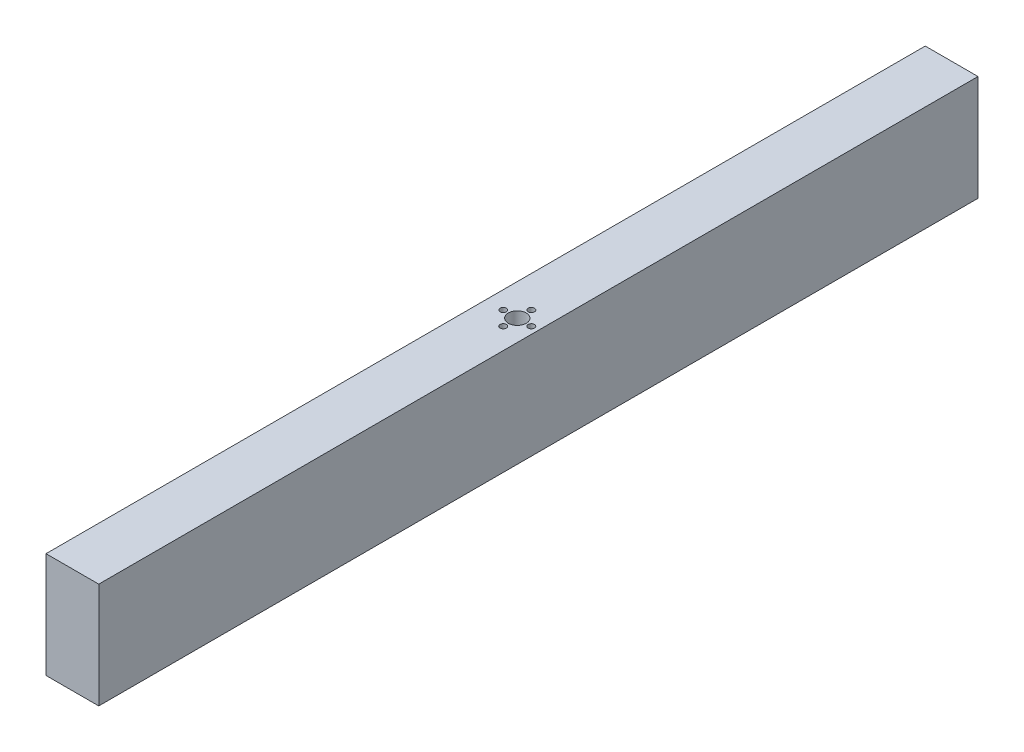
ISO-10303-21;
HEADER;
FILE_DESCRIPTION(('STEP AP214'),'2;1');
FILE_NAME('part.step','',(''),(''),'','','');
FILE_SCHEMA(('AUTOMOTIVE_DESIGN { 1 0 10303 214 1 1 1 1 }'));
ENDSEC;
DATA;
#1=APPLICATION_CONTEXT('core data for automotive mechanical design processes');
#2=APPLICATION_PROTOCOL_DEFINITION('international standard','automotive_design',2000,#1);
#3=PRODUCT_CONTEXT('',#1,'mechanical');
#4=PRODUCT('Part','Part','',(#3));
#5=PRODUCT_RELATED_PRODUCT_CATEGORY('part','',(#4));
#6=PRODUCT_DEFINITION_FORMATION('','',#4);
#7=PRODUCT_DEFINITION_CONTEXT('part definition',#1,'design');
#8=PRODUCT_DEFINITION('design','',#6,#7);
#9=PRODUCT_DEFINITION_SHAPE('','',#8);
#10=(LENGTH_UNIT() NAMED_UNIT(*) SI_UNIT(.MILLI.,.METRE.));
#11=(NAMED_UNIT(*) PLANE_ANGLE_UNIT() SI_UNIT($,.RADIAN.));
#12=(NAMED_UNIT(*) SI_UNIT($,.STERADIAN.) SOLID_ANGLE_UNIT());
#13=UNCERTAINTY_MEASURE_WITH_UNIT(LENGTH_MEASURE(1.E-05),#10,'distance_accuracy_value','');
#14=(GEOMETRIC_REPRESENTATION_CONTEXT(3) GLOBAL_UNCERTAINTY_ASSIGNED_CONTEXT((#13)) GLOBAL_UNIT_ASSIGNED_CONTEXT((#10,
#11,#12)) REPRESENTATION_CONTEXT('',''));
#15=CARTESIAN_POINT('',(0.,0.,0.));
#16=DIRECTION('',(0.,0.,1.));
#17=DIRECTION('',(1.,0.,0.));
#18=AXIS2_PLACEMENT_3D('',#15,#16,#17);
#19=CARTESIAN_POINT('',(2.99999999999998,30.,0.));
#20=DIRECTION('',(0.,-1.,0.));
#21=DIRECTION('',(0.,0.,-1.));
#22=AXIS2_PLACEMENT_3D('',#19,#20,#21);
#23=CYLINDRICAL_SURFACE('',#22,4.5);
#24=CARTESIAN_POINT('',(2.99999999999998,-20.,0.));
#25=DIRECTION('',(0.,-1.,0.));
#26=DIRECTION('',(0.,0.,-1.));
#27=AXIS2_PLACEMENT_3D('',#24,#25,#26);
#28=CIRCLE('',#27,4.5);
#29=CARTESIAN_POINT('',(2.99999999999998,-20.,-4.5));
#30=VERTEX_POINT('',#29);
#31=EDGE_CURVE('E124',#30,#30,#28,.F.);
#32=CARTESIAN_POINT('',(2.99999999999998,20.,0.));
#33=DIRECTION('',(0.,1.,0.));
#34=DIRECTION('',(0.,0.,1.));
#35=AXIS2_PLACEMENT_3D('',#32,#33,#34);
#36=CIRCLE('',#35,4.5);
#37=CARTESIAN_POINT('',(2.99999999999998,20.,-4.5));
#38=VERTEX_POINT('',#37);
#39=EDGE_CURVE('E42',#38,#38,#36,.F.);
#40=CARTESIAN_POINT('',(2.99999999999998,-20.,-4.5));
#41=CARTESIAN_POINT('',(2.99999999999998,-19.5833333333333,-4.5));
#42=CARTESIAN_POINT('',(2.99999999999998,-19.1666666666667,-4.5));
#43=CARTESIAN_POINT('',(2.99999999999998,-18.3333333333333,-4.5));
#44=CARTESIAN_POINT('',(2.99999999999998,-17.9166666666667,-4.5));
#45=CARTESIAN_POINT('',(2.99999999999998,-17.0833333333333,-4.5));
#46=CARTESIAN_POINT('',(2.99999999999998,-16.6666666666667,-4.5));
#47=CARTESIAN_POINT('',(2.99999999999998,-15.8333333333333,-4.5));
#48=CARTESIAN_POINT('',(2.99999999999998,-15.4166666666667,-4.5));
#49=CARTESIAN_POINT('',(2.99999999999998,-14.5833333333333,-4.5));
#50=CARTESIAN_POINT('',(2.99999999999998,-14.1666666666667,-4.5));
#51=CARTESIAN_POINT('',(2.99999999999998,-13.3333333333333,-4.5));
#52=CARTESIAN_POINT('',(2.99999999999998,-12.9166666666667,-4.5));
#53=CARTESIAN_POINT('',(2.99999999999998,-12.0833333333333,-4.5));
#54=CARTESIAN_POINT('',(2.99999999999998,-11.6666666666667,-4.5));
#55=CARTESIAN_POINT('',(2.99999999999998,-10.8333333333333,-4.5));
#56=CARTESIAN_POINT('',(2.99999999999998,-10.4166666666667,-4.5));
#57=CARTESIAN_POINT('',(2.99999999999998,-9.58333333333333,-4.5));
#58=CARTESIAN_POINT('',(2.99999999999998,-9.16666666666666,-4.5));
#59=CARTESIAN_POINT('',(2.99999999999998,-8.33333333333333,-4.5));
#60=CARTESIAN_POINT('',(2.99999999999998,-7.91666666666666,-4.5));
#61=CARTESIAN_POINT('',(2.99999999999998,-7.08333333333333,-4.5));
#62=CARTESIAN_POINT('',(2.99999999999998,-6.66666666666666,-4.5));
#63=CARTESIAN_POINT('',(2.99999999999998,-5.83333333333333,-4.5));
#64=CARTESIAN_POINT('',(2.99999999999998,-5.41666666666666,-4.5));
#65=CARTESIAN_POINT('',(2.99999999999998,-4.58333333333333,-4.5));
#66=CARTESIAN_POINT('',(2.99999999999998,-4.16666666666666,-4.5));
#67=CARTESIAN_POINT('',(2.99999999999998,-3.33333333333333,-4.5));
#68=CARTESIAN_POINT('',(2.99999999999998,-2.91666666666666,-4.5));
#69=CARTESIAN_POINT('',(2.99999999999998,-2.08333333333333,-4.5));
#70=CARTESIAN_POINT('',(2.99999999999998,-1.66666666666666,-4.5));
#71=CARTESIAN_POINT('',(2.99999999999998,-0.833333333333331,-4.5));
#72=CARTESIAN_POINT('',(2.99999999999998,-0.416666666666664,-4.5));
#73=CARTESIAN_POINT('',(2.99999999999998,0.41666666666667,-4.5));
#74=CARTESIAN_POINT('',(2.99999999999998,0.833333333333337,-4.5));
#75=CARTESIAN_POINT('',(2.99999999999998,1.66666666666667,-4.5));
#76=CARTESIAN_POINT('',(2.99999999999998,2.08333333333334,-4.5));
#77=CARTESIAN_POINT('',(2.99999999999998,2.91666666666667,-4.5));
#78=CARTESIAN_POINT('',(2.99999999999998,3.33333333333334,-4.5));
#79=CARTESIAN_POINT('',(2.99999999999998,4.16666666666667,-4.5));
#80=CARTESIAN_POINT('',(2.99999999999998,4.58333333333334,-4.5));
#81=CARTESIAN_POINT('',(2.99999999999998,5.41666666666667,-4.5));
#82=CARTESIAN_POINT('',(2.99999999999998,5.83333333333334,-4.5));
#83=CARTESIAN_POINT('',(2.99999999999998,6.66666666666667,-4.5));
#84=CARTESIAN_POINT('',(2.99999999999998,7.08333333333334,-4.5));
#85=CARTESIAN_POINT('',(2.99999999999998,7.91666666666667,-4.5));
#86=CARTESIAN_POINT('',(2.99999999999998,8.33333333333334,-4.5));
#87=CARTESIAN_POINT('',(2.99999999999998,9.16666666666667,-4.5));
#88=CARTESIAN_POINT('',(2.99999999999998,9.58333333333334,-4.5));
#89=CARTESIAN_POINT('',(2.99999999999998,10.4166666666667,-4.5));
#90=CARTESIAN_POINT('',(2.99999999999998,10.8333333333333,-4.5));
#91=CARTESIAN_POINT('',(2.99999999999998,11.6666666666667,-4.5));
#92=CARTESIAN_POINT('',(2.99999999999998,12.0833333333333,-4.5));
#93=CARTESIAN_POINT('',(2.99999999999998,12.9166666666667,-4.5));
#94=CARTESIAN_POINT('',(2.99999999999998,13.3333333333333,-4.5));
#95=CARTESIAN_POINT('',(2.99999999999998,14.1666666666667,-4.5));
#96=CARTESIAN_POINT('',(2.99999999999998,14.5833333333333,-4.5));
#97=CARTESIAN_POINT('',(2.99999999999998,15.4166666666667,-4.5));
#98=CARTESIAN_POINT('',(2.99999999999998,15.8333333333333,-4.5));
#99=CARTESIAN_POINT('',(2.99999999999998,16.6666666666667,-4.5));
#100=CARTESIAN_POINT('',(2.99999999999998,17.0833333333333,-4.5));
#101=CARTESIAN_POINT('',(2.99999999999998,17.9166666666667,-4.5));
#102=CARTESIAN_POINT('',(2.99999999999998,18.3333333333333,-4.5));
#103=CARTESIAN_POINT('',(2.99999999999998,19.1666666666667,-4.5));
#104=CARTESIAN_POINT('',(2.99999999999998,19.5833333333333,-4.5));
#105=CARTESIAN_POINT('',(2.99999999999998,20.,-4.5));
#106=B_SPLINE_CURVE_WITH_KNOTS('',3,(#40,#41,#42,#43,#44,#45,#46,#47,#48,#49,#50,#51,#52,#53,
#54,#55,#56,#57,#58,#59,#60,#61,#62,#63,#64,#65,#66,#67,#68,#69,#70,#71,#72,#73,#74,#75,#76,#77,
#78,#79,#80,#81,#82,#83,#84,#85,#86,#87,#88,#89,#90,#91,#92,#93,#94,#95,#96,#97,#98,#99,#100,
#101,#102,#103,#104,#105),.UNSPECIFIED.,.F.,.F.,(4,2,2,2,2,2,2,2,2,2,2,2,2,2,2,2,2,2,2,2,2,2,2,
2,2,2,2,2,2,2,2,2,4),(0.,1.25,2.5,3.75,5.,6.25,7.5,8.75,10.,11.25,12.5,13.75,15.,16.25,17.5,
18.75,20.,21.25,22.5,23.75,25.,26.25,27.5,28.75,30.,31.25,32.5,33.75,35.,36.25,37.5,38.75,40.),.UNSPECIFIED.);
#107=EDGE_CURVE('BSEAM38',#30,#38,#106,.T.);
#108=ORIENTED_EDGE('',*,*,#31,.F.);
#109=ORIENTED_EDGE('',*,*,#39,.F.);
#110=ORIENTED_EDGE('',*,*,#107,.T.);
#111=ORIENTED_EDGE('',*,*,#107,.F.);
#112=EDGE_LOOP('',(#108,#110,#109,#111));
#113=FACE_BOUND('',#112,.T.);
#114=ADVANCED_FACE('F38',(#113),#23,.F.);
#115=CARTESIAN_POINT('',(15.,-30.,250.));
#116=DIRECTION('',(-1.,0.,0.));
#117=DIRECTION('',(0.,0.,1.));
#118=AXIS2_PLACEMENT_3D('',#115,#116,#117);
#119=PLANE('',#118);
#120=DIRECTION('',(0.,1.,0.));
#121=VECTOR('',#120,1.);
#122=CARTESIAN_POINT('',(15.,-30.,-250.));
#123=LINE('',#122,#121);
#124=CARTESIAN_POINT('',(15.,-30.,-250.));
#125=VERTEX_POINT('',#124);
#126=CARTESIAN_POINT('',(15.,30.,-250.));
#127=VERTEX_POINT('',#126);
#128=EDGE_CURVE('E110',#125,#127,#123,.T.);
#129=ORIENTED_EDGE('',*,*,#128,.T.);
#130=DIRECTION('',(0.,0.,-1.));
#131=VECTOR('',#130,1.);
#132=CARTESIAN_POINT('',(15.,30.,250.));
#133=LINE('',#132,#131);
#134=CARTESIAN_POINT('',(15.,30.,250.));
#135=VERTEX_POINT('',#134);
#136=EDGE_CURVE('E11',#135,#127,#133,.T.);
#137=ORIENTED_EDGE('',*,*,#136,.F.);
#138=DIRECTION('',(0.,1.,0.));
#139=VECTOR('',#138,1.);
#140=CARTESIAN_POINT('',(15.,-30.,250.));
#141=LINE('',#140,#139);
#142=CARTESIAN_POINT('',(15.,-30.,250.));
#143=VERTEX_POINT('',#142);
#144=EDGE_CURVE('E93',#143,#135,#141,.T.);
#145=ORIENTED_EDGE('',*,*,#144,.F.);
#146=DIRECTION('',(0.,0.,-1.));
#147=VECTOR('',#146,1.);
#148=CARTESIAN_POINT('',(15.,-30.,250.));
#149=LINE('',#148,#147);
#150=EDGE_CURVE('E106',#143,#125,#149,.T.);
#151=ORIENTED_EDGE('',*,*,#150,.T.);
#152=EDGE_LOOP('',(#129,#137,#145,#151));
#153=FACE_BOUND('',#152,.T.);
#154=ADVANCED_FACE('F40',(#153),#119,.F.);
#155=CARTESIAN_POINT('',(-15.,30.,250.));
#156=DIRECTION('',(0.,-1.,0.));
#157=DIRECTION('',(0.,0.,-1.));
#158=AXIS2_PLACEMENT_3D('',#155,#156,#157);
#159=PLANE('',#158);
#160=CARTESIAN_POINT('',(2.99999999999998,30.,0.));
#161=DIRECTION('',(0.,-1.,0.));
#162=DIRECTION('',(0.,0.,-1.));
#163=AXIS2_PLACEMENT_3D('',#160,#161,#162);
#164=CIRCLE('',#163,5.1);
#165=CARTESIAN_POINT('',(2.99999999999998,30.,-5.1));
#166=VERTEX_POINT('',#165);
#167=EDGE_CURVE('E145',#166,#166,#164,.T.);
#168=ORIENTED_EDGE('',*,*,#167,.T.);
#169=EDGE_LOOP('',(#168));
#170=FACE_BOUND('',#169,.T.);
#171=CARTESIAN_POINT('',(11.,30.,0.));
#172=DIRECTION('',(0.,-1.,0.));
#173=DIRECTION('',(0.,0.,-1.));
#174=AXIS2_PLACEMENT_3D('',#171,#172,#173);
#175=CIRCLE('',#174,1.8);
#176=CARTESIAN_POINT('',(11.,30.,-1.8));
#177=VERTEX_POINT('',#176);
#178=EDGE_CURVE('E114',#177,#177,#175,.T.);
#179=ORIENTED_EDGE('',*,*,#178,.T.);
#180=EDGE_LOOP('',(#179));
#181=FACE_BOUND('',#180,.T.);
#182=CARTESIAN_POINT('',(2.99999999999998,30.,-8.));
#183=DIRECTION('',(0.,-1.,0.));
#184=DIRECTION('',(0.,0.,-1.));
#185=AXIS2_PLACEMENT_3D('',#182,#183,#184);
#186=CIRCLE('',#185,1.8);
#187=CARTESIAN_POINT('',(2.99999999999998,30.,-9.8));
#188=VERTEX_POINT('',#187);
#189=EDGE_CURVE('E167',#188,#188,#186,.T.);
#190=ORIENTED_EDGE('',*,*,#189,.T.);
#191=EDGE_LOOP('',(#190));
#192=FACE_BOUND('',#191,.T.);
#193=CARTESIAN_POINT('',(-5.00000000000002,30.,0.));
#194=DIRECTION('',(0.,-1.,0.));
#195=DIRECTION('',(0.,0.,-1.));
#196=AXIS2_PLACEMENT_3D('',#193,#194,#195);
#197=CIRCLE('',#196,1.8);
#198=CARTESIAN_POINT('',(-5.00000000000002,30.,-1.8));
#199=VERTEX_POINT('',#198);
#200=EDGE_CURVE('E148',#199,#199,#197,.T.);
#201=ORIENTED_EDGE('',*,*,#200,.T.);
#202=EDGE_LOOP('',(#201));
#203=FACE_BOUND('',#202,.T.);
#204=CARTESIAN_POINT('',(2.99999999999998,30.,8.));
#205=DIRECTION('',(0.,-1.,0.));
#206=DIRECTION('',(0.,0.,-1.));
#207=AXIS2_PLACEMENT_3D('',#204,#205,#206);
#208=CIRCLE('',#207,1.8);
#209=CARTESIAN_POINT('',(2.99999999999998,30.,6.2));
#210=VERTEX_POINT('',#209);
#211=EDGE_CURVE('E134',#210,#210,#208,.T.);
#212=ORIENTED_EDGE('',*,*,#211,.T.);
#213=EDGE_LOOP('',(#212));
#214=FACE_BOUND('',#213,.T.);
#215=DIRECTION('',(-1.,0.,0.));
#216=VECTOR('',#215,1.);
#217=CARTESIAN_POINT('',(-15.,30.,-250.));
#218=LINE('',#217,#216);
#219=CARTESIAN_POINT('',(-15.,30.,-250.));
#220=VERTEX_POINT('',#219);
#221=EDGE_CURVE('E98',#127,#220,#218,.T.);
#222=ORIENTED_EDGE('',*,*,#221,.T.);
#223=DIRECTION('',(0.,0.,-1.));
#224=VECTOR('',#223,1.);
#225=CARTESIAN_POINT('',(-15.,30.,250.));
#226=LINE('',#225,#224);
#227=CARTESIAN_POINT('',(-15.,30.,250.));
#228=VERTEX_POINT('',#227);
#229=EDGE_CURVE('E49',#228,#220,#226,.T.);
#230=ORIENTED_EDGE('',*,*,#229,.F.);
#231=DIRECTION('',(-1.,0.,0.));
#232=VECTOR('',#231,1.);
#233=CARTESIAN_POINT('',(-15.,30.,250.));
#234=LINE('',#233,#232);
#235=EDGE_CURVE('E88',#135,#228,#234,.T.);
#236=ORIENTED_EDGE('',*,*,#235,.F.);
#237=ORIENTED_EDGE('',*,*,#136,.T.);
#238=EDGE_LOOP('',(#222,#230,#236,#237));
#239=FACE_BOUND('',#238,.T.);
#240=ADVANCED_FACE('F97',(#170,#181,#192,#203,#214,#239),#159,.F.);
#241=CARTESIAN_POINT('',(-15.,-30.,250.));
#242=DIRECTION('',(1.,0.,0.));
#243=DIRECTION('',(0.,0.,-1.));
#244=AXIS2_PLACEMENT_3D('',#241,#242,#243);
#245=PLANE('',#244);
#246=DIRECTION('',(0.,-1.,0.));
#247=VECTOR('',#246,1.);
#248=CARTESIAN_POINT('',(-15.,-30.,-250.));
#249=LINE('',#248,#247);
#250=CARTESIAN_POINT('',(-15.,-30.,-250.));
#251=VERTEX_POINT('',#250);
#252=EDGE_CURVE('E75',#220,#251,#249,.T.);
#253=ORIENTED_EDGE('',*,*,#252,.T.);
#254=DIRECTION('',(0.,0.,-1.));
#255=VECTOR('',#254,1.);
#256=CARTESIAN_POINT('',(-15.,-30.,250.));
#257=LINE('',#256,#255);
#258=CARTESIAN_POINT('',(-15.,-30.,250.));
#259=VERTEX_POINT('',#258);
#260=EDGE_CURVE('E100',#259,#251,#257,.T.);
#261=ORIENTED_EDGE('',*,*,#260,.F.);
#262=DIRECTION('',(0.,-1.,0.));
#263=VECTOR('',#262,1.);
#264=CARTESIAN_POINT('',(-15.,-30.,250.));
#265=LINE('',#264,#263);
#266=EDGE_CURVE('E91',#228,#259,#265,.T.);
#267=ORIENTED_EDGE('',*,*,#266,.F.);
#268=ORIENTED_EDGE('',*,*,#229,.T.);
#269=EDGE_LOOP('',(#253,#261,#267,#268));
#270=FACE_BOUND('',#269,.T.);
#271=ADVANCED_FACE('F102',(#270),#245,.F.);
#272=CARTESIAN_POINT('',(-15.,-30.,250.));
#273=DIRECTION('',(0.,1.,0.));
#274=DIRECTION('',(0.,0.,1.));
#275=AXIS2_PLACEMENT_3D('',#272,#273,#274);
#276=PLANE('',#275);
#277=CARTESIAN_POINT('',(2.99999999999998,-30.,0.));
#278=DIRECTION('',(0.,-1.,0.));
#279=DIRECTION('',(0.,0.,-1.));
#280=AXIS2_PLACEMENT_3D('',#277,#278,#279);
#281=CIRCLE('',#280,5.1);
#282=CARTESIAN_POINT('',(2.99999999999998,-30.,-5.1));
#283=VERTEX_POINT('',#282);
#284=EDGE_CURVE('E137',#283,#283,#281,.T.);
#285=ORIENTED_EDGE('',*,*,#284,.F.);
#286=EDGE_LOOP('',(#285));
#287=FACE_BOUND('',#286,.T.);
#288=CARTESIAN_POINT('',(11.,-30.,0.));
#289=DIRECTION('',(0.,-1.,0.));
#290=DIRECTION('',(0.,0.,-1.));
#291=AXIS2_PLACEMENT_3D('',#288,#289,#290);
#292=CIRCLE('',#291,1.8);
#293=CARTESIAN_POINT('',(11.,-30.,-1.8));
#294=VERTEX_POINT('',#293);
#295=EDGE_CURVE('E163',#294,#294,#292,.T.);
#296=ORIENTED_EDGE('',*,*,#295,.F.);
#297=EDGE_LOOP('',(#296));
#298=FACE_BOUND('',#297,.T.);
#299=CARTESIAN_POINT('',(2.99999999999998,-30.,-8.));
#300=DIRECTION('',(0.,-1.,0.));
#301=DIRECTION('',(0.,0.,-1.));
#302=AXIS2_PLACEMENT_3D('',#299,#300,#301);
#303=CIRCLE('',#302,1.8);
#304=CARTESIAN_POINT('',(2.99999999999998,-30.,-9.8));
#305=VERTEX_POINT('',#304);
#306=EDGE_CURVE('E152',#305,#305,#303,.T.);
#307=ORIENTED_EDGE('',*,*,#306,.F.);
#308=EDGE_LOOP('',(#307));
#309=FACE_BOUND('',#308,.T.);
#310=CARTESIAN_POINT('',(-5.00000000000002,-30.,0.));
#311=DIRECTION('',(0.,-1.,0.));
#312=DIRECTION('',(0.,0.,-1.));
#313=AXIS2_PLACEMENT_3D('',#310,#311,#312);
#314=CIRCLE('',#313,1.8);
#315=CARTESIAN_POINT('',(-5.00000000000002,-30.,-1.8));
#316=VERTEX_POINT('',#315);
#317=EDGE_CURVE('E153',#316,#316,#314,.T.);
#318=ORIENTED_EDGE('',*,*,#317,.F.);
#319=EDGE_LOOP('',(#318));
#320=FACE_BOUND('',#319,.T.);
#321=CARTESIAN_POINT('',(2.99999999999998,-30.,8.));
#322=DIRECTION('',(0.,-1.,0.));
#323=DIRECTION('',(0.,0.,-1.));
#324=AXIS2_PLACEMENT_3D('',#321,#322,#323);
#325=CIRCLE('',#324,1.8);
#326=CARTESIAN_POINT('',(2.99999999999998,-30.,6.2));
#327=VERTEX_POINT('',#326);
#328=EDGE_CURVE('E127',#327,#327,#325,.T.);
#329=ORIENTED_EDGE('',*,*,#328,.F.);
#330=EDGE_LOOP('',(#329));
#331=FACE_BOUND('',#330,.T.);
#332=DIRECTION('',(1.,0.,0.));
#333=VECTOR('',#332,1.);
#334=CARTESIAN_POINT('',(-15.,-30.,-250.));
#335=LINE('',#334,#333);
#336=EDGE_CURVE('E81',#251,#125,#335,.T.);
#337=ORIENTED_EDGE('',*,*,#336,.T.);
#338=ORIENTED_EDGE('',*,*,#150,.F.);
#339=DIRECTION('',(1.,0.,0.));
#340=VECTOR('',#339,1.);
#341=CARTESIAN_POINT('',(-15.,-30.,250.));
#342=LINE('',#341,#340);
#343=EDGE_CURVE('E58',#259,#143,#342,.T.);
#344=ORIENTED_EDGE('',*,*,#343,.F.);
#345=ORIENTED_EDGE('',*,*,#260,.T.);
#346=EDGE_LOOP('',(#337,#338,#344,#345));
#347=FACE_BOUND('',#346,.T.);
#348=ADVANCED_FACE('F178',(#287,#298,#309,#320,#331,#347),#276,.F.);
#349=CARTESIAN_POINT('',(0.,0.,250.));
#350=DIRECTION('',(0.,0.,-1.));
#351=DIRECTION('',(-1.,0.,0.));
#352=AXIS2_PLACEMENT_3D('',#349,#350,#351);
#353=PLANE('',#352);
#354=ORIENTED_EDGE('',*,*,#144,.T.);
#355=ORIENTED_EDGE('',*,*,#235,.T.);
#356=ORIENTED_EDGE('',*,*,#266,.T.);
#357=ORIENTED_EDGE('',*,*,#343,.T.);
#358=EDGE_LOOP('',(#354,#355,#356,#357));
#359=FACE_BOUND('',#358,.T.);
#360=ADVANCED_FACE('F89',(#359),#353,.F.);
#361=CARTESIAN_POINT('',(0.,0.,-250.));
#362=DIRECTION('',(0.,0.,-1.));
#363=DIRECTION('',(-1.,0.,0.));
#364=AXIS2_PLACEMENT_3D('',#361,#362,#363);
#365=PLANE('',#364);
#366=ORIENTED_EDGE('',*,*,#128,.F.);
#367=ORIENTED_EDGE('',*,*,#336,.F.);
#368=ORIENTED_EDGE('',*,*,#252,.F.);
#369=ORIENTED_EDGE('',*,*,#221,.F.);
#370=EDGE_LOOP('',(#366,#367,#368,#369));
#371=FACE_BOUND('',#370,.T.);
#372=ADVANCED_FACE('F190',(#371),#365,.T.);
#373=CARTESIAN_POINT('',(2.99999999999998,30.,8.));
#374=DIRECTION('',(0.,-1.,0.));
#375=DIRECTION('',(0.,0.,-1.));
#376=AXIS2_PLACEMENT_3D('',#373,#374,#375);
#377=CYLINDRICAL_SURFACE('',#376,1.8);
#378=CARTESIAN_POINT('',(2.99999999999998,30.,6.2));
#379=CARTESIAN_POINT('',(2.99999999999998,29.375,6.2));
#380=CARTESIAN_POINT('',(2.99999999999998,28.75,6.2));
#381=CARTESIAN_POINT('',(2.99999999999998,27.5,6.2));
#382=CARTESIAN_POINT('',(2.99999999999998,26.875,6.2));
#383=CARTESIAN_POINT('',(2.99999999999998,25.625,6.2));
#384=CARTESIAN_POINT('',(2.99999999999998,25.,6.2));
#385=CARTESIAN_POINT('',(2.99999999999998,23.75,6.2));
#386=CARTESIAN_POINT('',(2.99999999999998,23.125,6.2));
#387=CARTESIAN_POINT('',(2.99999999999998,21.875,6.2));
#388=CARTESIAN_POINT('',(2.99999999999998,21.25,6.2));
#389=CARTESIAN_POINT('',(2.99999999999998,20.,6.2));
#390=CARTESIAN_POINT('',(2.99999999999998,19.375,6.2));
#391=CARTESIAN_POINT('',(2.99999999999998,18.125,6.2));
#392=CARTESIAN_POINT('',(2.99999999999998,17.5,6.2));
#393=CARTESIAN_POINT('',(2.99999999999998,16.25,6.2));
#394=CARTESIAN_POINT('',(2.99999999999998,15.625,6.2));
#395=CARTESIAN_POINT('',(2.99999999999998,14.375,6.2));
#396=CARTESIAN_POINT('',(2.99999999999998,13.75,6.2));
#397=CARTESIAN_POINT('',(2.99999999999998,12.5,6.2));
#398=CARTESIAN_POINT('',(2.99999999999998,11.875,6.2));
#399=CARTESIAN_POINT('',(2.99999999999998,10.625,6.2));
#400=CARTESIAN_POINT('',(2.99999999999998,10.,6.2));
#401=CARTESIAN_POINT('',(2.99999999999998,8.75,6.2));
#402=CARTESIAN_POINT('',(2.99999999999998,8.125,6.2));
#403=CARTESIAN_POINT('',(2.99999999999998,6.875,6.2));
#404=CARTESIAN_POINT('',(2.99999999999998,6.25,6.2));
#405=CARTESIAN_POINT('',(2.99999999999998,4.99999999999999,6.2));
#406=CARTESIAN_POINT('',(2.99999999999998,4.375,6.2));
#407=CARTESIAN_POINT('',(2.99999999999998,3.125,6.2));
#408=CARTESIAN_POINT('',(2.99999999999998,2.5,6.2));
#409=CARTESIAN_POINT('',(2.99999999999998,1.25,6.2));
#410=CARTESIAN_POINT('',(2.99999999999998,0.624999999999997,6.2));
#411=CARTESIAN_POINT('',(2.99999999999998,-0.625000000000004,6.2));
#412=CARTESIAN_POINT('',(2.99999999999998,-1.25,6.2));
#413=CARTESIAN_POINT('',(2.99999999999998,-2.50000000000001,6.2));
#414=CARTESIAN_POINT('',(2.99999999999998,-3.12500000000001,6.2));
#415=CARTESIAN_POINT('',(2.99999999999998,-4.375,6.2));
#416=CARTESIAN_POINT('',(2.99999999999998,-5.,6.2));
#417=CARTESIAN_POINT('',(2.99999999999998,-6.25,6.2));
#418=CARTESIAN_POINT('',(2.99999999999998,-6.875,6.2));
#419=CARTESIAN_POINT('',(2.99999999999998,-8.125,6.2));
#420=CARTESIAN_POINT('',(2.99999999999998,-8.75,6.2));
#421=CARTESIAN_POINT('',(2.99999999999998,-10.,6.2));
#422=CARTESIAN_POINT('',(2.99999999999998,-10.625,6.2));
#423=CARTESIAN_POINT('',(2.99999999999998,-11.875,6.2));
#424=CARTESIAN_POINT('',(2.99999999999998,-12.5,6.2));
#425=CARTESIAN_POINT('',(2.99999999999998,-13.75,6.2));
#426=CARTESIAN_POINT('',(2.99999999999998,-14.375,6.2));
#427=CARTESIAN_POINT('',(2.99999999999998,-15.625,6.2));
#428=CARTESIAN_POINT('',(2.99999999999998,-16.25,6.2));
#429=CARTESIAN_POINT('',(2.99999999999998,-17.5,6.2));
#430=CARTESIAN_POINT('',(2.99999999999998,-18.125,6.2));
#431=CARTESIAN_POINT('',(2.99999999999998,-19.375,6.2));
#432=CARTESIAN_POINT('',(2.99999999999998,-20.,6.2));
#433=CARTESIAN_POINT('',(2.99999999999998,-21.25,6.2));
#434=CARTESIAN_POINT('',(2.99999999999998,-21.875,6.2));
#435=CARTESIAN_POINT('',(2.99999999999998,-23.125,6.2));
#436=CARTESIAN_POINT('',(2.99999999999998,-23.75,6.2));
#437=CARTESIAN_POINT('',(2.99999999999998,-25.,6.2));
#438=CARTESIAN_POINT('',(2.99999999999998,-25.625,6.2));
#439=CARTESIAN_POINT('',(2.99999999999998,-26.875,6.2));
#440=CARTESIAN_POINT('',(2.99999999999998,-27.5,6.2));
#441=CARTESIAN_POINT('',(2.99999999999998,-28.75,6.2));
#442=CARTESIAN_POINT('',(2.99999999999998,-29.375,6.2));
#443=CARTESIAN_POINT('',(2.99999999999998,-30.,6.2));
#444=B_SPLINE_CURVE_WITH_KNOTS('',3,(#378,#379,#380,#381,#382,#383,#384,#385,#386,#387,#388,
#389,#390,#391,#392,#393,#394,#395,#396,#397,#398,#399,#400,#401,#402,#403,#404,#405,#406,#407,
#408,#409,#410,#411,#412,#413,#414,#415,#416,#417,#418,#419,#420,#421,#422,#423,#424,#425,#426,
#427,#428,#429,#430,#431,#432,#433,#434,#435,#436,#437,#438,#439,#440,#441,#442,#443),
.UNSPECIFIED.,.F.,.F.,(4,2,2,2,2,2,2,2,2,2,2,2,2,2,2,2,2,2,2,2,2,2,2,2,2,2,2,2,2,2,2,2,4),(0.,
1.875,3.75,5.625,7.5,9.375,11.25,13.125,15.,16.875,18.75,20.625,22.5,24.375,26.25,28.125,30.,
31.875,33.75,35.625,37.5,39.375,41.25,43.125,45.,46.875,48.75,50.625,52.5,54.375,56.25,58.125,
60.),.UNSPECIFIED.);
#445=EDGE_CURVE('BSEAM187',#210,#327,#444,.T.);
#446=ORIENTED_EDGE('',*,*,#211,.F.);
#447=ORIENTED_EDGE('',*,*,#328,.T.);
#448=ORIENTED_EDGE('',*,*,#445,.T.);
#449=ORIENTED_EDGE('',*,*,#445,.F.);
#450=EDGE_LOOP('',(#446,#448,#447,#449));
#451=FACE_BOUND('',#450,.T.);
#452=ADVANCED_FACE('F187',(#451),#377,.F.);
#453=CARTESIAN_POINT('',(-5.00000000000002,30.,0.));
#454=DIRECTION('',(0.,-1.,0.));
#455=DIRECTION('',(0.,0.,-1.));
#456=AXIS2_PLACEMENT_3D('',#453,#454,#455);
#457=CYLINDRICAL_SURFACE('',#456,1.8);
#458=CARTESIAN_POINT('',(-5.00000000000002,30.,-1.8));
#459=CARTESIAN_POINT('',(-5.00000000000002,29.375,-1.8));
#460=CARTESIAN_POINT('',(-5.00000000000002,28.75,-1.8));
#461=CARTESIAN_POINT('',(-5.00000000000002,27.5,-1.8));
#462=CARTESIAN_POINT('',(-5.00000000000002,26.875,-1.8));
#463=CARTESIAN_POINT('',(-5.00000000000002,25.625,-1.8));
#464=CARTESIAN_POINT('',(-5.00000000000002,25.,-1.8));
#465=CARTESIAN_POINT('',(-5.00000000000002,23.75,-1.8));
#466=CARTESIAN_POINT('',(-5.00000000000002,23.125,-1.8));
#467=CARTESIAN_POINT('',(-5.00000000000002,21.875,-1.8));
#468=CARTESIAN_POINT('',(-5.00000000000002,21.25,-1.8));
#469=CARTESIAN_POINT('',(-5.00000000000002,20.,-1.8));
#470=CARTESIAN_POINT('',(-5.00000000000002,19.375,-1.8));
#471=CARTESIAN_POINT('',(-5.00000000000002,18.125,-1.8));
#472=CARTESIAN_POINT('',(-5.00000000000002,17.5,-1.8));
#473=CARTESIAN_POINT('',(-5.00000000000002,16.25,-1.8));
#474=CARTESIAN_POINT('',(-5.00000000000002,15.625,-1.8));
#475=CARTESIAN_POINT('',(-5.00000000000002,14.375,-1.8));
#476=CARTESIAN_POINT('',(-5.00000000000002,13.75,-1.8));
#477=CARTESIAN_POINT('',(-5.00000000000002,12.5,-1.8));
#478=CARTESIAN_POINT('',(-5.00000000000002,11.875,-1.8));
#479=CARTESIAN_POINT('',(-5.00000000000002,10.625,-1.8));
#480=CARTESIAN_POINT('',(-5.00000000000002,10.,-1.8));
#481=CARTESIAN_POINT('',(-5.00000000000002,8.75,-1.8));
#482=CARTESIAN_POINT('',(-5.00000000000002,8.125,-1.8));
#483=CARTESIAN_POINT('',(-5.00000000000002,6.875,-1.8));
#484=CARTESIAN_POINT('',(-5.00000000000002,6.25,-1.8));
#485=CARTESIAN_POINT('',(-5.00000000000002,4.99999999999999,-1.8));
#486=CARTESIAN_POINT('',(-5.00000000000002,4.375,-1.8));
#487=CARTESIAN_POINT('',(-5.00000000000002,3.125,-1.8));
#488=CARTESIAN_POINT('',(-5.00000000000002,2.5,-1.8));
#489=CARTESIAN_POINT('',(-5.00000000000002,1.25,-1.8));
#490=CARTESIAN_POINT('',(-5.00000000000002,0.624999999999997,-1.8));
#491=CARTESIAN_POINT('',(-5.00000000000002,-0.625000000000004,-1.8));
#492=CARTESIAN_POINT('',(-5.00000000000002,-1.25,-1.8));
#493=CARTESIAN_POINT('',(-5.00000000000002,-2.50000000000001,-1.8));
#494=CARTESIAN_POINT('',(-5.00000000000002,-3.12500000000001,-1.8));
#495=CARTESIAN_POINT('',(-5.00000000000002,-4.375,-1.8));
#496=CARTESIAN_POINT('',(-5.00000000000002,-5.,-1.8));
#497=CARTESIAN_POINT('',(-5.00000000000002,-6.25,-1.8));
#498=CARTESIAN_POINT('',(-5.00000000000002,-6.875,-1.8));
#499=CARTESIAN_POINT('',(-5.00000000000002,-8.125,-1.8));
#500=CARTESIAN_POINT('',(-5.00000000000002,-8.75,-1.8));
#501=CARTESIAN_POINT('',(-5.00000000000002,-10.,-1.8));
#502=CARTESIAN_POINT('',(-5.00000000000002,-10.625,-1.8));
#503=CARTESIAN_POINT('',(-5.00000000000002,-11.875,-1.8));
#504=CARTESIAN_POINT('',(-5.00000000000002,-12.5,-1.8));
#505=CARTESIAN_POINT('',(-5.00000000000002,-13.75,-1.8));
#506=CARTESIAN_POINT('',(-5.00000000000002,-14.375,-1.8));
#507=CARTESIAN_POINT('',(-5.00000000000002,-15.625,-1.8));
#508=CARTESIAN_POINT('',(-5.00000000000002,-16.25,-1.8));
#509=CARTESIAN_POINT('',(-5.00000000000002,-17.5,-1.8));
#510=CARTESIAN_POINT('',(-5.00000000000002,-18.125,-1.8));
#511=CARTESIAN_POINT('',(-5.00000000000002,-19.375,-1.8));
#512=CARTESIAN_POINT('',(-5.00000000000002,-20.,-1.8));
#513=CARTESIAN_POINT('',(-5.00000000000002,-21.25,-1.8));
#514=CARTESIAN_POINT('',(-5.00000000000002,-21.875,-1.8));
#515=CARTESIAN_POINT('',(-5.00000000000002,-23.125,-1.8));
#516=CARTESIAN_POINT('',(-5.00000000000002,-23.75,-1.8));
#517=CARTESIAN_POINT('',(-5.00000000000002,-25.,-1.8));
#518=CARTESIAN_POINT('',(-5.00000000000002,-25.625,-1.8));
#519=CARTESIAN_POINT('',(-5.00000000000002,-26.875,-1.8));
#520=CARTESIAN_POINT('',(-5.00000000000002,-27.5,-1.8));
#521=CARTESIAN_POINT('',(-5.00000000000002,-28.75,-1.8));
#522=CARTESIAN_POINT('',(-5.00000000000002,-29.375,-1.8));
#523=CARTESIAN_POINT('',(-5.00000000000002,-30.,-1.8));
#524=B_SPLINE_CURVE_WITH_KNOTS('',3,(#458,#459,#460,#461,#462,#463,#464,#465,#466,#467,#468,
#469,#470,#471,#472,#473,#474,#475,#476,#477,#478,#479,#480,#481,#482,#483,#484,#485,#486,#487,
#488,#489,#490,#491,#492,#493,#494,#495,#496,#497,#498,#499,#500,#501,#502,#503,#504,#505,#506,
#507,#508,#509,#510,#511,#512,#513,#514,#515,#516,#517,#518,#519,#520,#521,#522,#523),
.UNSPECIFIED.,.F.,.F.,(4,2,2,2,2,2,2,2,2,2,2,2,2,2,2,2,2,2,2,2,2,2,2,2,2,2,2,2,2,2,2,2,4),(0.,
1.875,3.75,5.625,7.5,9.375,11.25,13.125,15.,16.875,18.75,20.625,22.5,24.375,26.25,28.125,30.,
31.875,33.75,35.625,37.5,39.375,41.25,43.125,45.,46.875,48.75,50.625,52.5,54.375,56.25,58.125,
60.),.UNSPECIFIED.);
#525=EDGE_CURVE('BSEAM189',#199,#316,#524,.T.);
#526=ORIENTED_EDGE('',*,*,#200,.F.);
#527=ORIENTED_EDGE('',*,*,#317,.T.);
#528=ORIENTED_EDGE('',*,*,#525,.T.);
#529=ORIENTED_EDGE('',*,*,#525,.F.);
#530=EDGE_LOOP('',(#526,#528,#527,#529));
#531=FACE_BOUND('',#530,.T.);
#532=ADVANCED_FACE('F189',(#531),#457,.F.);
#533=CARTESIAN_POINT('',(2.99999999999998,30.,-8.));
#534=DIRECTION('',(0.,-1.,0.));
#535=DIRECTION('',(0.,0.,-1.));
#536=AXIS2_PLACEMENT_3D('',#533,#534,#535);
#537=CYLINDRICAL_SURFACE('',#536,1.8);
#538=CARTESIAN_POINT('',(2.99999999999998,30.,-9.8));
#539=CARTESIAN_POINT('',(2.99999999999998,29.375,-9.8));
#540=CARTESIAN_POINT('',(2.99999999999998,28.75,-9.8));
#541=CARTESIAN_POINT('',(2.99999999999998,27.5,-9.8));
#542=CARTESIAN_POINT('',(2.99999999999998,26.875,-9.8));
#543=CARTESIAN_POINT('',(2.99999999999998,25.625,-9.8));
#544=CARTESIAN_POINT('',(2.99999999999998,25.,-9.8));
#545=CARTESIAN_POINT('',(2.99999999999998,23.75,-9.8));
#546=CARTESIAN_POINT('',(2.99999999999998,23.125,-9.8));
#547=CARTESIAN_POINT('',(2.99999999999998,21.875,-9.8));
#548=CARTESIAN_POINT('',(2.99999999999998,21.25,-9.8));
#549=CARTESIAN_POINT('',(2.99999999999998,20.,-9.8));
#550=CARTESIAN_POINT('',(2.99999999999998,19.375,-9.8));
#551=CARTESIAN_POINT('',(2.99999999999998,18.125,-9.8));
#552=CARTESIAN_POINT('',(2.99999999999998,17.5,-9.8));
#553=CARTESIAN_POINT('',(2.99999999999998,16.25,-9.8));
#554=CARTESIAN_POINT('',(2.99999999999998,15.625,-9.8));
#555=CARTESIAN_POINT('',(2.99999999999998,14.375,-9.8));
#556=CARTESIAN_POINT('',(2.99999999999998,13.75,-9.8));
#557=CARTESIAN_POINT('',(2.99999999999998,12.5,-9.8));
#558=CARTESIAN_POINT('',(2.99999999999998,11.875,-9.8));
#559=CARTESIAN_POINT('',(2.99999999999998,10.625,-9.8));
#560=CARTESIAN_POINT('',(2.99999999999998,10.,-9.8));
#561=CARTESIAN_POINT('',(2.99999999999998,8.75,-9.8));
#562=CARTESIAN_POINT('',(2.99999999999998,8.125,-9.8));
#563=CARTESIAN_POINT('',(2.99999999999998,6.875,-9.8));
#564=CARTESIAN_POINT('',(2.99999999999998,6.25,-9.8));
#565=CARTESIAN_POINT('',(2.99999999999998,4.99999999999999,-9.8));
#566=CARTESIAN_POINT('',(2.99999999999998,4.375,-9.8));
#567=CARTESIAN_POINT('',(2.99999999999998,3.125,-9.8));
#568=CARTESIAN_POINT('',(2.99999999999998,2.5,-9.8));
#569=CARTESIAN_POINT('',(2.99999999999998,1.25,-9.8));
#570=CARTESIAN_POINT('',(2.99999999999998,0.624999999999997,-9.8));
#571=CARTESIAN_POINT('',(2.99999999999998,-0.625000000000004,-9.8));
#572=CARTESIAN_POINT('',(2.99999999999998,-1.25,-9.8));
#573=CARTESIAN_POINT('',(2.99999999999998,-2.50000000000001,-9.8));
#574=CARTESIAN_POINT('',(2.99999999999998,-3.12500000000001,-9.8));
#575=CARTESIAN_POINT('',(2.99999999999998,-4.375,-9.8));
#576=CARTESIAN_POINT('',(2.99999999999998,-5.,-9.8));
#577=CARTESIAN_POINT('',(2.99999999999998,-6.25,-9.8));
#578=CARTESIAN_POINT('',(2.99999999999998,-6.875,-9.8));
#579=CARTESIAN_POINT('',(2.99999999999998,-8.125,-9.8));
#580=CARTESIAN_POINT('',(2.99999999999998,-8.75,-9.8));
#581=CARTESIAN_POINT('',(2.99999999999998,-10.,-9.8));
#582=CARTESIAN_POINT('',(2.99999999999998,-10.625,-9.8));
#583=CARTESIAN_POINT('',(2.99999999999998,-11.875,-9.8));
#584=CARTESIAN_POINT('',(2.99999999999998,-12.5,-9.8));
#585=CARTESIAN_POINT('',(2.99999999999998,-13.75,-9.8));
#586=CARTESIAN_POINT('',(2.99999999999998,-14.375,-9.8));
#587=CARTESIAN_POINT('',(2.99999999999998,-15.625,-9.8));
#588=CARTESIAN_POINT('',(2.99999999999998,-16.25,-9.8));
#589=CARTESIAN_POINT('',(2.99999999999998,-17.5,-9.8));
#590=CARTESIAN_POINT('',(2.99999999999998,-18.125,-9.8));
#591=CARTESIAN_POINT('',(2.99999999999998,-19.375,-9.8));
#592=CARTESIAN_POINT('',(2.99999999999998,-20.,-9.8));
#593=CARTESIAN_POINT('',(2.99999999999998,-21.25,-9.8));
#594=CARTESIAN_POINT('',(2.99999999999998,-21.875,-9.8));
#595=CARTESIAN_POINT('',(2.99999999999998,-23.125,-9.8));
#596=CARTESIAN_POINT('',(2.99999999999998,-23.75,-9.8));
#597=CARTESIAN_POINT('',(2.99999999999998,-25.,-9.8));
#598=CARTESIAN_POINT('',(2.99999999999998,-25.625,-9.8));
#599=CARTESIAN_POINT('',(2.99999999999998,-26.875,-9.8));
#600=CARTESIAN_POINT('',(2.99999999999998,-27.5,-9.8));
#601=CARTESIAN_POINT('',(2.99999999999998,-28.75,-9.8));
#602=CARTESIAN_POINT('',(2.99999999999998,-29.375,-9.8));
#603=CARTESIAN_POINT('',(2.99999999999998,-30.,-9.8));
#604=B_SPLINE_CURVE_WITH_KNOTS('',3,(#538,#539,#540,#541,#542,#543,#544,#545,#546,#547,#548,
#549,#550,#551,#552,#553,#554,#555,#556,#557,#558,#559,#560,#561,#562,#563,#564,#565,#566,#567,
#568,#569,#570,#571,#572,#573,#574,#575,#576,#577,#578,#579,#580,#581,#582,#583,#584,#585,#586,
#587,#588,#589,#590,#591,#592,#593,#594,#595,#596,#597,#598,#599,#600,#601,#602,#603),
.UNSPECIFIED.,.F.,.F.,(4,2,2,2,2,2,2,2,2,2,2,2,2,2,2,2,2,2,2,2,2,2,2,2,2,2,2,2,2,2,2,2,4),(0.,
1.875,3.75,5.625,7.5,9.375,11.25,13.125,15.,16.875,18.75,20.625,22.5,24.375,26.25,28.125,30.,
31.875,33.75,35.625,37.5,39.375,41.25,43.125,45.,46.875,48.75,50.625,52.5,54.375,56.25,58.125,
60.),.UNSPECIFIED.);
#605=EDGE_CURVE('BSEAM176',#188,#305,#604,.T.);
#606=ORIENTED_EDGE('',*,*,#189,.F.);
#607=ORIENTED_EDGE('',*,*,#306,.T.);
#608=ORIENTED_EDGE('',*,*,#605,.T.);
#609=ORIENTED_EDGE('',*,*,#605,.F.);
#610=EDGE_LOOP('',(#606,#608,#607,#609));
#611=FACE_BOUND('',#610,.T.);
#612=ADVANCED_FACE('F176',(#611),#537,.F.);
#613=CARTESIAN_POINT('',(11.,30.,0.));
#614=DIRECTION('',(0.,-1.,0.));
#615=DIRECTION('',(0.,0.,-1.));
#616=AXIS2_PLACEMENT_3D('',#613,#614,#615);
#617=CYLINDRICAL_SURFACE('',#616,1.8);
#618=CARTESIAN_POINT('',(11.,30.,-1.8));
#619=CARTESIAN_POINT('',(11.,29.375,-1.8));
#620=CARTESIAN_POINT('',(11.,28.75,-1.8));
#621=CARTESIAN_POINT('',(11.,27.5,-1.8));
#622=CARTESIAN_POINT('',(11.,26.875,-1.8));
#623=CARTESIAN_POINT('',(11.,25.625,-1.8));
#624=CARTESIAN_POINT('',(11.,25.,-1.8));
#625=CARTESIAN_POINT('',(11.,23.75,-1.8));
#626=CARTESIAN_POINT('',(11.,23.125,-1.8));
#627=CARTESIAN_POINT('',(11.,21.875,-1.8));
#628=CARTESIAN_POINT('',(11.,21.25,-1.8));
#629=CARTESIAN_POINT('',(11.,20.,-1.8));
#630=CARTESIAN_POINT('',(11.,19.375,-1.8));
#631=CARTESIAN_POINT('',(11.,18.125,-1.8));
#632=CARTESIAN_POINT('',(11.,17.5,-1.8));
#633=CARTESIAN_POINT('',(11.,16.25,-1.8));
#634=CARTESIAN_POINT('',(11.,15.625,-1.8));
#635=CARTESIAN_POINT('',(11.,14.375,-1.8));
#636=CARTESIAN_POINT('',(11.,13.75,-1.8));
#637=CARTESIAN_POINT('',(11.,12.5,-1.8));
#638=CARTESIAN_POINT('',(11.,11.875,-1.8));
#639=CARTESIAN_POINT('',(11.,10.625,-1.8));
#640=CARTESIAN_POINT('',(11.,10.,-1.8));
#641=CARTESIAN_POINT('',(11.,8.75,-1.8));
#642=CARTESIAN_POINT('',(11.,8.125,-1.8));
#643=CARTESIAN_POINT('',(11.,6.875,-1.8));
#644=CARTESIAN_POINT('',(11.,6.25,-1.8));
#645=CARTESIAN_POINT('',(11.,4.99999999999999,-1.8));
#646=CARTESIAN_POINT('',(11.,4.375,-1.8));
#647=CARTESIAN_POINT('',(11.,3.125,-1.8));
#648=CARTESIAN_POINT('',(11.,2.5,-1.8));
#649=CARTESIAN_POINT('',(11.,1.25,-1.8));
#650=CARTESIAN_POINT('',(11.,0.624999999999997,-1.8));
#651=CARTESIAN_POINT('',(11.,-0.625000000000004,-1.8));
#652=CARTESIAN_POINT('',(11.,-1.25,-1.8));
#653=CARTESIAN_POINT('',(11.,-2.50000000000001,-1.8));
#654=CARTESIAN_POINT('',(11.,-3.12500000000001,-1.8));
#655=CARTESIAN_POINT('',(11.,-4.375,-1.8));
#656=CARTESIAN_POINT('',(11.,-5.,-1.8));
#657=CARTESIAN_POINT('',(11.,-6.25,-1.8));
#658=CARTESIAN_POINT('',(11.,-6.875,-1.8));
#659=CARTESIAN_POINT('',(11.,-8.125,-1.8));
#660=CARTESIAN_POINT('',(11.,-8.75,-1.8));
#661=CARTESIAN_POINT('',(11.,-10.,-1.8));
#662=CARTESIAN_POINT('',(11.,-10.625,-1.8));
#663=CARTESIAN_POINT('',(11.,-11.875,-1.8));
#664=CARTESIAN_POINT('',(11.,-12.5,-1.8));
#665=CARTESIAN_POINT('',(11.,-13.75,-1.8));
#666=CARTESIAN_POINT('',(11.,-14.375,-1.8));
#667=CARTESIAN_POINT('',(11.,-15.625,-1.8));
#668=CARTESIAN_POINT('',(11.,-16.25,-1.8));
#669=CARTESIAN_POINT('',(11.,-17.5,-1.8));
#670=CARTESIAN_POINT('',(11.,-18.125,-1.8));
#671=CARTESIAN_POINT('',(11.,-19.375,-1.8));
#672=CARTESIAN_POINT('',(11.,-20.,-1.8));
#673=CARTESIAN_POINT('',(11.,-21.25,-1.8));
#674=CARTESIAN_POINT('',(11.,-21.875,-1.8));
#675=CARTESIAN_POINT('',(11.,-23.125,-1.8));
#676=CARTESIAN_POINT('',(11.,-23.75,-1.8));
#677=CARTESIAN_POINT('',(11.,-25.,-1.8));
#678=CARTESIAN_POINT('',(11.,-25.625,-1.8));
#679=CARTESIAN_POINT('',(11.,-26.875,-1.8));
#680=CARTESIAN_POINT('',(11.,-27.5,-1.8));
#681=CARTESIAN_POINT('',(11.,-28.75,-1.8));
#682=CARTESIAN_POINT('',(11.,-29.375,-1.8));
#683=CARTESIAN_POINT('',(11.,-30.,-1.8));
#684=B_SPLINE_CURVE_WITH_KNOTS('',3,(#618,#619,#620,#621,#622,#623,#624,#625,#626,#627,#628,
#629,#630,#631,#632,#633,#634,#635,#636,#637,#638,#639,#640,#641,#642,#643,#644,#645,#646,#647,
#648,#649,#650,#651,#652,#653,#654,#655,#656,#657,#658,#659,#660,#661,#662,#663,#664,#665,#666,
#667,#668,#669,#670,#671,#672,#673,#674,#675,#676,#677,#678,#679,#680,#681,#682,#683),
.UNSPECIFIED.,.F.,.F.,(4,2,2,2,2,2,2,2,2,2,2,2,2,2,2,2,2,2,2,2,2,2,2,2,2,2,2,2,2,2,2,2,4),(0.,
1.875,3.75,5.625,7.5,9.375,11.25,13.125,15.,16.875,18.75,20.625,22.5,24.375,26.25,28.125,30.,
31.875,33.75,35.625,37.5,39.375,41.25,43.125,45.,46.875,48.75,50.625,52.5,54.375,56.25,58.125,
60.),.UNSPECIFIED.);
#685=EDGE_CURVE('BSEAM233',#177,#294,#684,.T.);
#686=ORIENTED_EDGE('',*,*,#178,.F.);
#687=ORIENTED_EDGE('',*,*,#295,.T.);
#688=ORIENTED_EDGE('',*,*,#685,.T.);
#689=ORIENTED_EDGE('',*,*,#685,.F.);
#690=EDGE_LOOP('',(#686,#688,#687,#689));
#691=FACE_BOUND('',#690,.T.);
#692=ADVANCED_FACE('F233',(#691),#617,.F.);
#693=CARTESIAN_POINT('',(2.99999999999998,-20.,0.));
#694=DIRECTION('',(0.,-1.,0.));
#695=DIRECTION('',(0.,0.,-1.));
#696=AXIS2_PLACEMENT_3D('',#693,#694,#695);
#697=PLANE('',#696);
#698=CARTESIAN_POINT('',(2.99999999999998,-20.,0.));
#699=DIRECTION('',(0.,-1.,0.));
#700=DIRECTION('',(0.,0.,-1.));
#701=AXIS2_PLACEMENT_3D('',#698,#699,#700);
#702=CIRCLE('',#701,5.1);
#703=CARTESIAN_POINT('',(2.99999999999998,-20.,-5.1));
#704=VERTEX_POINT('',#703);
#705=EDGE_CURVE('E128',#704,#704,#702,.T.);
#706=ORIENTED_EDGE('',*,*,#705,.T.);
#707=EDGE_LOOP('',(#706));
#708=FACE_BOUND('',#707,.T.);
#709=ORIENTED_EDGE('',*,*,#31,.T.);
#710=EDGE_LOOP('',(#709));
#711=FACE_BOUND('',#710,.T.);
#712=ADVANCED_FACE('F237',(#708,#711),#697,.T.);
#713=CARTESIAN_POINT('',(2.99999999999998,-20.,0.));
#714=DIRECTION('',(0.,-1.,0.));
#715=DIRECTION('',(0.,0.,-1.));
#716=AXIS2_PLACEMENT_3D('',#713,#714,#715);
#717=CYLINDRICAL_SURFACE('',#716,5.1);
#718=ORIENTED_EDGE('',*,*,#705,.F.);
#719=EDGE_LOOP('',(#718));
#720=FACE_BOUND('',#719,.T.);
#721=ORIENTED_EDGE('',*,*,#284,.T.);
#722=EDGE_LOOP('',(#721));
#723=FACE_BOUND('',#722,.T.);
#724=ADVANCED_FACE('F242',(#720,#723),#717,.F.);
#725=CARTESIAN_POINT('',(2.99999999999998,20.,0.));
#726=DIRECTION('',(0.,1.,0.));
#727=DIRECTION('',(0.,0.,-1.));
#728=AXIS2_PLACEMENT_3D('',#725,#726,#727);
#729=PLANE('',#728);
#730=CARTESIAN_POINT('',(2.99999999999998,20.,0.));
#731=DIRECTION('',(0.,-1.,0.));
#732=DIRECTION('',(0.,0.,-1.));
#733=AXIS2_PLACEMENT_3D('',#730,#731,#732);
#734=CIRCLE('',#733,5.1);
#735=CARTESIAN_POINT('',(2.99999999999998,20.,-5.1));
#736=VERTEX_POINT('',#735);
#737=EDGE_CURVE('E264',#736,#736,#734,.T.);
#738=ORIENTED_EDGE('',*,*,#737,.F.);
#739=EDGE_LOOP('',(#738));
#740=FACE_BOUND('',#739,.T.);
#741=ORIENTED_EDGE('',*,*,#39,.T.);
#742=EDGE_LOOP('',(#741));
#743=FACE_BOUND('',#742,.T.);
#744=ADVANCED_FACE('F250',(#740,#743),#729,.T.);
#745=CARTESIAN_POINT('',(2.99999999999998,20.,0.));
#746=DIRECTION('',(0.,1.,0.));
#747=DIRECTION('',(0.,0.,1.));
#748=AXIS2_PLACEMENT_3D('',#745,#746,#747);
#749=CYLINDRICAL_SURFACE('',#748,5.1);
#750=ORIENTED_EDGE('',*,*,#737,.T.);
#751=EDGE_LOOP('',(#750));
#752=FACE_BOUND('',#751,.T.);
#753=ORIENTED_EDGE('',*,*,#167,.F.);
#754=EDGE_LOOP('',(#753));
#755=FACE_BOUND('',#754,.T.);
#756=ADVANCED_FACE('F254',(#752,#755),#749,.F.);
#757=CLOSED_SHELL('',(#114,#154,#240,#271,#348,#360,#372,#452,#532,#612,#692,#712,#724,#744,#756));
#758=MANIFOLD_SOLID_BREP('B2',#757);
#759=ADVANCED_BREP_SHAPE_REPRESENTATION('',(#18,#758),#14);
#760=SHAPE_DEFINITION_REPRESENTATION(#9,#759);
ENDSEC;
END-ISO-10303-21;
